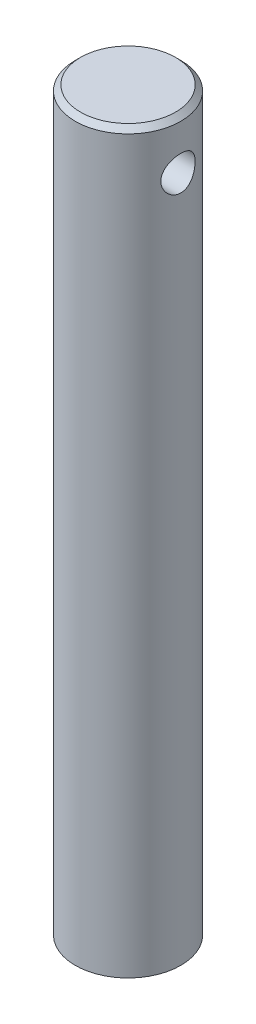
ISO-10303-21;
HEADER;
FILE_DESCRIPTION(('STEP AP214'),'2;1');
FILE_NAME('part.step','',(''),(''),'','','');
FILE_SCHEMA(('AUTOMOTIVE_DESIGN { 1 0 10303 214 1 1 1 1 }'));
ENDSEC;
DATA;
#1=APPLICATION_CONTEXT('core data for automotive mechanical design processes');
#2=APPLICATION_PROTOCOL_DEFINITION('international standard','automotive_design',2000,#1);
#3=PRODUCT_CONTEXT('',#1,'mechanical');
#4=PRODUCT('Part','Part','',(#3));
#5=PRODUCT_RELATED_PRODUCT_CATEGORY('part','',(#4));
#6=PRODUCT_DEFINITION_FORMATION('','',#4);
#7=PRODUCT_DEFINITION_CONTEXT('part definition',#1,'design');
#8=PRODUCT_DEFINITION('design','',#6,#7);
#9=PRODUCT_DEFINITION_SHAPE('','',#8);
#10=(LENGTH_UNIT() NAMED_UNIT(*) SI_UNIT(.MILLI.,.METRE.));
#11=(NAMED_UNIT(*) PLANE_ANGLE_UNIT() SI_UNIT($,.RADIAN.));
#12=(NAMED_UNIT(*) SI_UNIT($,.STERADIAN.) SOLID_ANGLE_UNIT());
#13=UNCERTAINTY_MEASURE_WITH_UNIT(LENGTH_MEASURE(1.E-05),#10,'distance_accuracy_value','');
#14=(GEOMETRIC_REPRESENTATION_CONTEXT(3) GLOBAL_UNCERTAINTY_ASSIGNED_CONTEXT((#13)) GLOBAL_UNIT_ASSIGNED_CONTEXT((#10,
#11,#12)) REPRESENTATION_CONTEXT('',''));
#15=CARTESIAN_POINT('',(0.,0.,0.));
#16=DIRECTION('',(0.,0.,1.));
#17=DIRECTION('',(1.,0.,0.));
#18=AXIS2_PLACEMENT_3D('',#15,#16,#17);
#19=CARTESIAN_POINT('',(0.,9.5,0.));
#20=DIRECTION('',(0.,-1.,0.));
#21=DIRECTION('',(1.,0.,0.));
#22=AXIS2_PLACEMENT_3D('',#19,#20,#21);
#23=CYLINDRICAL_SURFACE('',#22,10.);
#24=CARTESIAN_POINT('',(0.,8.50000000000004,0.));
#25=DIRECTION('',(0.,1.,0.));
#26=DIRECTION('',(-1.,0.,0.));
#27=AXIS2_PLACEMENT_3D('',#24,#25,#26);
#28=CIRCLE('',#27,10.);
#29=CARTESIAN_POINT('',(-10.,8.50000000000004,0.));
#30=VERTEX_POINT('',#29);
#31=EDGE_CURVE('E43',#30,#30,#28,.F.);
#32=ORIENTED_EDGE('',*,*,#31,.T.);
#33=EDGE_LOOP('',(#32));
#34=FACE_BOUND('',#33,.T.);
#35=CARTESIAN_POINT('',(10.,3.24999999999999,0.));
#36=CARTESIAN_POINT('',(9.99999989374565,3.24999997889345,0.177579382949033));
#37=CARTESIAN_POINT('',(9.99522579386108,3.23539803652838,0.355160799428107));
#38=CARTESIAN_POINT('',(9.97665017824228,3.17754433327152,0.705108112257457));
#39=CARTESIAN_POINT('',(9.96284727999529,3.13428818476131,0.877473205641292));
#40=CARTESIAN_POINT('',(9.92771716006863,3.02075477282472,1.21189182680223));
#41=CARTESIAN_POINT('',(9.90640214525769,2.95052132980789,1.37396158278685));
#42=CARTESIAN_POINT('',(9.85843361438871,2.78522034821618,1.684022624021));
#43=CARTESIAN_POINT('',(9.83177912896556,2.69014829931106,1.83201134569423));
#44=CARTESIAN_POINT('',(9.77495932247797,2.47455893870756,2.11461081148197));
#45=CARTESIAN_POINT('',(9.74471295358529,2.3533668062036,2.24869037174635));
#46=CARTESIAN_POINT('',(9.68457368482561,2.09041303391271,2.49502344091045));
#47=CARTESIAN_POINT('',(9.65468085893924,1.9486471685403,2.60727245498119));
#48=CARTESIAN_POINT('',(9.59775056049016,1.64386297324906,2.80972801137822));
#49=CARTESIAN_POINT('',(9.57081237727236,1.48037295020163,2.89925504445895));
#50=CARTESIAN_POINT('',(9.52406830823477,1.13964009979186,3.04931887139798));
#51=CARTESIAN_POINT('',(9.50426036852438,0.962401250734404,3.10986401524673));
#52=CARTESIAN_POINT('',(9.47487062348531,0.605224003478048,3.19827260971517));
#53=CARTESIAN_POINT('',(9.46497952226559,0.425557170356609,3.22712741042678));
#54=CARTESIAN_POINT('',(9.45562707493594,0.0636810429937451,3.25443459132066));
#55=CARTESIAN_POINT('',(9.45616269242515,-0.118527495623612,3.25289582251764));
#56=CARTESIAN_POINT('',(9.46733131423129,-0.471965078358155,3.22023155138035));
#57=CARTESIAN_POINT('',(9.47752750417875,-0.643328575736205,3.19038591816137));
#58=CARTESIAN_POINT('',(9.50615574812356,-0.978469733817753,3.10403782395805));
#59=CARTESIAN_POINT('',(9.52458874278655,-1.14224652574034,3.04753231830215));
#60=CARTESIAN_POINT('',(9.56793440052134,-1.46053027476877,2.90860404188738));
#61=CARTESIAN_POINT('',(9.5929431291382,-1.61485405825679,2.82579288678075));
#62=CARTESIAN_POINT('',(9.64658062480913,-1.90782592967286,2.63687365185909));
#63=CARTESIAN_POINT('',(9.67521039451251,-2.04646965564834,2.53075911343125));
#64=CARTESIAN_POINT('',(9.73459644737762,-2.31135580532947,2.29204406554377));
#65=CARTESIAN_POINT('',(9.76538786414675,-2.4366454392497,2.1583929888821));
#66=CARTESIAN_POINT('',(9.82438470108507,-2.66327506616693,1.87159594889805));
#67=CARTESIAN_POINT('',(9.85258989700937,-2.76461298356881,1.71844829781995));
#68=CARTESIAN_POINT('',(9.90357541398692,-2.94117958036254,1.39505996296229));
#69=CARTESIAN_POINT('',(9.92630448856869,-3.01616441859854,1.22467751353945));
#70=CARTESIAN_POINT('',(9.96340575158467,-3.13611754909862,0.872803501369045));
#71=CARTESIAN_POINT('',(9.97778069343972,-3.18109573191634,0.691315620659397));
#72=CARTESIAN_POINT('',(9.99610319938068,-3.2380973104139,0.330457295677702));
#73=CARTESIAN_POINT('',(10.0004581918424,-3.25140912385828,0.151310774152573));
#74=CARTESIAN_POINT('',(9.99946515119833,-3.2483550046277,-0.206684753642995));
#75=CARTESIAN_POINT('',(9.99411866512873,-3.23199380372956,-0.385533802797554));
#76=CARTESIAN_POINT('',(9.97459190888947,-3.17108387458638,-0.732777014929088));
#77=CARTESIAN_POINT('',(9.96065655544011,-3.12731612588182,-0.901323284372871));
#78=CARTESIAN_POINT('',(9.92560343144515,-3.01380236012891,-1.22862125569252));
#79=CARTESIAN_POINT('',(9.90448475494932,-2.94405306622037,-1.38737171915065));
#80=CARTESIAN_POINT('',(9.85654869030636,-2.77857272976549,-1.69509055480488));
#81=CARTESIAN_POINT('',(9.82959944293601,-2.68222317512508,-1.84370519348154));
#82=CARTESIAN_POINT('',(9.77306882676684,-2.46701009602674,-2.12308150730875));
#83=CARTESIAN_POINT('',(9.74348669127606,-2.34814000218299,-2.25383795390917));
#84=CARTESIAN_POINT('',(9.68341394517995,-2.08519902195576,-2.49964097258611));
#85=CARTESIAN_POINT('',(9.65293908057768,-1.94026325876254,-2.61376838975716));
#86=CARTESIAN_POINT('',(9.59584349220032,-1.63263899734481,-2.81618275812032));
#87=CARTESIAN_POINT('',(9.56922275883548,-1.46995054329393,-2.90446977360853));
#88=CARTESIAN_POINT('',(9.52312626728825,-1.1315474606046,-3.05222465357593));
#89=CARTESIAN_POINT('',(9.50363019104654,-0.955871619536967,-3.11177462835521));
#90=CARTESIAN_POINT('',(9.47422438151486,-0.59621221842745,-3.20020095668875));
#91=CARTESIAN_POINT('',(9.4643106083648,-0.412232193668311,-3.22909023717127));
#92=CARTESIAN_POINT('',(9.45563586870718,-0.0508598825570302,-3.2543985483994));
#93=CARTESIAN_POINT('',(9.45635339998917,0.126414793097428,-3.25233581624123));
#94=CARTESIAN_POINT('',(9.46758016662914,0.47795399616682,-3.21950614466644));
#95=CARTESIAN_POINT('',(9.47808887260454,0.652218685804804,-3.18874075712543));
#96=CARTESIAN_POINT('',(9.50733511912922,0.989832105728194,-3.10043070730133));
#97=CARTESIAN_POINT('',(9.52592844913926,1.15331678677853,-3.0433543427512));
#98=CARTESIAN_POINT('',(9.5692021691022,1.4685171754486,-2.90441722996808));
#99=CARTESIAN_POINT('',(9.59388386623479,1.62023034650381,-2.82255115849536));
#100=CARTESIAN_POINT('',(9.64784088636398,1.91445618346344,-2.63235879697991));
#101=CARTESIAN_POINT('',(9.67726517521805,2.05631852137468,-2.52306891129122));
#102=CARTESIAN_POINT('',(9.73674387050347,2.32018090698315,-2.28278717900074));
#103=CARTESIAN_POINT('',(9.76679844907542,2.44217544662851,-2.15178933442871));
#104=CARTESIAN_POINT('',(9.8254625209376,2.66729679821816,-1.86608754817447));
#105=CARTESIAN_POINT('',(9.85397977542082,2.76957658814279,-1.71069498742675));
#106=CARTESIAN_POINT('',(9.90514098282108,2.94644065367727,-1.38400159009725));
#107=CARTESIAN_POINT('',(9.92778677175249,3.0210335901562,-1.21270574929994));
#108=CARTESIAN_POINT('',(9.96349655119001,3.13633303599046,-0.869832380696061));
#109=CARTESIAN_POINT('',(9.97706030755102,3.17882738920053,-0.698908003473844));
#110=CARTESIAN_POINT('',(9.9953110007797,3.23565744357245,-0.351988917437685));
#111=CARTESIAN_POINT('',(10.0000001053066,3.25000002091827,-0.175995457426613));
#112=CARTESIAN_POINT('',(10.,3.24999999999999,0.));
#113=B_SPLINE_CURVE_WITH_KNOTS('',3,(#35,#36,#37,#38,#39,#40,#41,#42,#43,#44,#45,#46,#47,#48,
#49,#50,#51,#52,#53,#54,#55,#56,#57,#58,#59,#60,#61,#62,#63,#64,#65,#66,#67,#68,#69,#70,#71,#72,
#73,#74,#75,#76,#77,#78,#79,#80,#81,#82,#83,#84,#85,#86,#87,#88,#89,#90,#91,#92,#93,#94,#95,#96,
#97,#98,#99,#100,#101,#102,#103,#104,#105,#106,#107,#108,#109,#110,#111,#112),.UNSPECIFIED.,.T.,
.F.,(4,2,2,2,2,2,2,2,2,2,2,2,2,2,2,2,2,2,2,2,2,2,2,2,2,2,2,2,2,2,2,2,2,2,2,2,2,2,4),(0.,
0.532090801254675,1.06426309669591,1.59557459199054,2.1269826328768,2.67425296309552,
3.22163585524025,3.78384740278182,4.34589687356043,4.88981368187706,5.43357209666655,
5.95386117923409,6.47420969543024,7.00262882865677,7.53119460031025,8.0859084644215,
8.64067038102182,9.20043805582586,9.76002113320903,10.2964148728263,10.8327230844865,
11.3544036147969,11.8761499631048,12.4112318399366,12.9464700445871,13.5047604456697,
14.0630494576022,14.6197336846483,15.1761831133819,15.7054311330744,16.2346505394039,
16.7547941299286,17.2750494932519,17.8170673976498,18.3592353135955,18.9211107593864,
19.4828102935622,20.0102839458811,20.537628744608),.UNSPECIFIED.);
#114=CARTESIAN_POINT('',(10.,3.24999999999999,0.));
#115=VERTEX_POINT('',#114);
#116=EDGE_CURVE('E47',#115,#115,#113,.T.);
#117=ORIENTED_EDGE('',*,*,#116,.F.);
#118=EDGE_LOOP('',(#117));
#119=FACE_BOUND('',#118,.T.);
#120=CARTESIAN_POINT('',(-9.45714015968887,0.,3.24999999999999));
#121=CARTESIAN_POINT('',(-9.45714031975425,0.177299530983938,3.24999996594419));
#122=CARTESIAN_POINT('',(-9.46218061553846,0.354601079058454,3.23544233910945));
#123=CARTESIAN_POINT('',(-9.48169889974067,0.703969232437981,3.17778063387204));
#124=CARTESIAN_POINT('',(-9.49617883832328,0.87603474832516,3.13467065672282));
#125=CARTESIAN_POINT('',(-9.53276684736511,1.20981611796559,3.02156408763779));
#126=CARTESIAN_POINT('',(-9.55486055631606,1.37155078233966,2.95161808731895));
#127=CARTESIAN_POINT('',(-9.60416619680663,1.68103928814958,2.78699619388973));
#128=CARTESIAN_POINT('',(-9.63137916829215,1.82879027970761,2.6923152745147));
#129=CARTESIAN_POINT('',(-9.68899176574426,2.11161020214042,2.47714104411861));
#130=CARTESIAN_POINT('',(-9.7194679228496,2.2460831711087,2.35588471696471));
#131=CARTESIAN_POINT('',(-9.77952436884652,2.4931889671246,2.09263184494553));
#132=CARTESIAN_POINT('',(-9.8091045211573,2.60581847850233,1.95063215712303));
#133=CARTESIAN_POINT('',(-9.86491782280745,2.8087140059434,1.64559602796292));
#134=CARTESIAN_POINT('',(-9.89105042825693,2.89835993814045,1.48212711806989));
#135=CARTESIAN_POINT('',(-9.9361257418338,3.0486489618789,1.14143632793767));
#136=CARTESIAN_POINT('',(-9.95507028595169,3.10929946052839,0.96421797356028));
#137=CARTESIAN_POINT('',(-9.98309301263069,3.19786767905724,0.60730397546392));
#138=CARTESIAN_POINT('',(-9.99247790860662,3.22680538131057,0.427885967277268));
#139=CARTESIAN_POINT('',(-10.0014104232845,3.25436508562661,0.066512037622937));
#140=CARTESIAN_POINT('',(-10.0009604553388,3.2529945249563,-0.115443250276201));
#141=CARTESIAN_POINT('',(-9.99048411795756,3.22063335722291,-0.469523771450078));
#142=CARTESIAN_POINT('',(-9.98081565195022,3.19074972479527,-0.641762482940367));
#143=CARTESIAN_POINT('',(-9.95343429447757,3.1040354917331,-0.97863224640162));
#144=CARTESIAN_POINT('',(-9.93572086532967,3.04720308997488,-1.14326278907262));
#145=CARTESIAN_POINT('',(-9.89377411201859,2.90753211380048,-1.46271759756165));
#146=CARTESIAN_POINT('',(-9.869460261881,2.82437007909694,-1.61738943124247));
#147=CARTESIAN_POINT('',(-9.816856159246,2.6346641048776,-1.91091693128666));
#148=CARTESIAN_POINT('',(-9.78856484119447,2.52811389541833,-2.04976834129095));
#149=CARTESIAN_POINT('',(-9.72950106071726,2.28903467266802,-2.31430549384568));
#150=CARTESIAN_POINT('',(-9.69867422994172,2.15555416928405,-2.43912040936659));
#151=CARTESIAN_POINT('',(-9.63909486372544,1.86928290948064,-2.66486690355385));
#152=CARTESIAN_POINT('',(-9.61034261635581,1.7164894793945,-2.76579516980326));
#153=CARTESIAN_POINT('',(-9.55787955588514,1.39329252750949,-2.94202938013297));
#154=CARTESIAN_POINT('',(-9.53423890921103,1.22268644196096,-3.01698630603796));
#155=CARTESIAN_POINT('',(-9.49549194347806,0.870315322912828,-3.13682094119596));
#156=CARTESIAN_POINT('',(-9.48038225830743,0.68855472214663,-3.18171051560574));
#157=CARTESIAN_POINT('',(-9.46116378995737,0.327432460521432,-3.23840120551585));
#158=CARTESIAN_POINT('',(-9.45660869381159,0.148305376867856,-3.25154577533659));
#159=CARTESIAN_POINT('',(-9.45777099529463,-0.209616301729801,-3.24816506242595));
#160=CARTESIAN_POINT('',(-9.46348664335148,-0.388410948109536,-3.2316448329511));
#161=CARTESIAN_POINT('',(-9.48410320755962,-0.734615900338193,-3.17060807190335));
#162=CARTESIAN_POINT('',(-9.49870345169874,-0.902207412355537,-3.1270070478687));
#163=CARTESIAN_POINT('',(-9.53511831835135,-1.22766844067835,-3.0141352607906));
#164=CARTESIAN_POINT('',(-9.55693417915462,-1.38553628276091,-2.94486009149767));
#165=CARTESIAN_POINT('',(-9.60614721606396,-1.6924031656331,-2.78020029035673));
#166=CARTESIAN_POINT('',(-9.63369436385389,-1.84098469572416,-2.68408357895598));
#167=CARTESIAN_POINT('',(-9.69096725740347,-2.12039723434003,-2.46930881957964));
#168=CARTESIAN_POINT('',(-9.7206936131738,-2.25122324323777,-2.35064444508002));
#169=CARTESIAN_POINT('',(-9.780607139663,-2.4975409341215,-2.087745080266));
#170=CARTESIAN_POINT('',(-9.81075403007331,-2.61206762913436,-1.94259422975941));
#171=CARTESIAN_POINT('',(-9.86677456184763,-2.81519056272343,-1.63439731618794));
#172=CARTESIAN_POINT('',(-9.89264837523296,-2.90378784525126,-1.47135197394191));
#173=CARTESIAN_POINT('',(-9.93707445650379,-3.05170605154728,-1.13289346303608));
#174=CARTESIAN_POINT('',(-9.95567674524018,-3.11122772103829,-0.957574938068058));
#175=CARTESIAN_POINT('',(-9.98368172068449,-3.1997164245844,-0.598697534609189));
#176=CARTESIAN_POINT('',(-9.99308754661658,-3.22869388520756,-0.415141490398971));
#177=CARTESIAN_POINT('',(-10.0014145744501,-3.25436992604748,-0.0538483383324489));
#178=CARTESIAN_POINT('',(-10.0007868427667,-3.25245715886776,0.123780796472686));
#179=CARTESIAN_POINT('',(-9.99021560869602,-3.21980512056529,0.476070007471434));
#180=CARTESIAN_POINT('',(-9.98027280013974,-3.1890679964171,0.6507303038117));
#181=CARTESIAN_POINT('',(-9.95234501872029,-3.10054678173843,0.989620887576075));
#182=CARTESIAN_POINT('',(-9.93447846708206,-3.043160393528,1.15396550686852));
#183=CARTESIAN_POINT('',(-9.8925433503312,-2.90333387949336,1.47076416800392));
#184=CARTESIAN_POINT('',(-9.86847368418031,-2.82088930543359,1.62321609265707));
#185=CARTESIAN_POINT('',(-9.81555378161621,-2.629885547409,1.91784189154063));
#186=CARTESIAN_POINT('',(-9.78656335044512,-2.52049779238891,2.05945312297856));
#187=CARTESIAN_POINT('',(-9.72743554627142,-2.28014309487174,2.32276630111764));
#188=CARTESIAN_POINT('',(-9.69729781882272,-2.14916944132468,2.44446203257073));
#189=CARTESIAN_POINT('',(-9.63796513947999,-1.86361218902463,2.66901287727711));
#190=CARTESIAN_POINT('',(-9.60884528614325,-1.70833892746852,2.77101345238614));
#191=CARTESIAN_POINT('',(-9.5562255883988,-1.38195905685891,2.94738303474978));
#192=CARTESIAN_POINT('',(-9.53272393962415,-1.21085755582334,3.02176091768744));
#193=CARTESIAN_POINT('',(-9.49550334814009,-0.8684579158953,3.13669494452504));
#194=CARTESIAN_POINT('',(-9.48127131053796,-0.697820090795792,3.17905105398646));
#195=CARTESIAN_POINT('',(-9.46209103822374,-0.351454469118071,3.23569936279264));
#196=CARTESIAN_POINT('',(-9.45714000104206,-0.175728225307203,3.25000003375396));
#197=CARTESIAN_POINT('',(-9.45714015968887,0.,3.24999999999999));
#198=B_SPLINE_CURVE_WITH_KNOTS('',3,(#120,#121,#122,#123,#124,#125,#126,#127,#128,#129,#130,
#131,#132,#133,#134,#135,#136,#137,#138,#139,#140,#141,#142,#143,#144,#145,#146,#147,#148,#149,
#150,#151,#152,#153,#154,#155,#156,#157,#158,#159,#160,#161,#162,#163,#164,#165,#166,#167,#168,
#169,#170,#171,#172,#173,#174,#175,#176,#177,#178,#179,#180,#181,#182,#183,#184,#185,#186,#187,
#188,#189,#190,#191,#192,#193,#194,#195,#196,#197),.UNSPECIFIED.,.T.,.F.,(4,2,2,2,2,2,2,2,2,2,2,
2,2,2,2,2,2,2,2,2,2,2,2,2,2,2,2,2,2,2,2,2,2,2,2,2,2,2,4),(0.,0.53124850503718,1.06260679711987,
1.5929682491144,2.12343755726666,2.67180188546717,3.22024938614484,3.78222372984978,
4.34405443604297,4.88723029743205,5.43027287176743,5.95305557209679,6.4758732175863,
7.00538064397244,7.53503019539509,8.08845610905497,8.64195872265871,9.20263474595125,
9.76308938511444,10.2993744444866,10.8355681589328,11.3545536787972,11.8736283092984,
12.4085390846315,12.9436001698432,13.5029364155138,14.0622501384862,14.6176456234263,
15.1728514571604,15.7031706450782,16.2334503354495,16.7560588347682,17.2787601598329,
17.8201569265526,18.3617223320028,18.9231471315413,19.4843913784855,20.0110907944362,
20.5376311438055),.UNSPECIFIED.);
#199=CARTESIAN_POINT('',(-9.45714015968887,0.,3.24999999999999));
#200=VERTEX_POINT('',#199);
#201=EDGE_CURVE('E51',#200,#200,#198,.T.);
#202=ORIENTED_EDGE('',*,*,#201,.F.);
#203=EDGE_LOOP('',(#202));
#204=FACE_BOUND('',#203,.T.);
#205=CARTESIAN_POINT('',(0.,-130.,0.));
#206=DIRECTION('',(0.,-1.,0.));
#207=DIRECTION('',(1.,0.,0.));
#208=AXIS2_PLACEMENT_3D('',#205,#206,#207);
#209=CIRCLE('',#208,9.99999999999999);
#210=CARTESIAN_POINT('',(9.99999999999999,-130.,0.));
#211=VERTEX_POINT('',#210);
#212=EDGE_CURVE('E88',#211,#211,#209,.T.);
#213=ORIENTED_EDGE('',*,*,#212,.F.);
#214=EDGE_LOOP('',(#213));
#215=FACE_BOUND('',#214,.T.);
#216=ADVANCED_FACE('F35',(#34,#119,#204,#215),#23,.T.);
#217=CARTESIAN_POINT('',(10.,9.50000000000001,0.));
#218=DIRECTION('',(0.,1.,0.));
#219=DIRECTION('',(-1.,0.,0.));
#220=AXIS2_PLACEMENT_3D('',#217,#218,#219);
#221=PLANE('',#220);
#222=CARTESIAN_POINT('',(0.,9.50000000000001,0.));
#223=DIRECTION('',(0.,1.,0.));
#224=DIRECTION('',(-1.,0.,0.));
#225=AXIS2_PLACEMENT_3D('',#222,#223,#224);
#226=CIRCLE('',#225,9.00000000000002);
#227=CARTESIAN_POINT('',(-9.00000000000002,9.50000000000001,0.));
#228=VERTEX_POINT('',#227);
#229=EDGE_CURVE('E10',#228,#228,#226,.T.);
#230=ORIENTED_EDGE('',*,*,#229,.T.);
#231=EDGE_LOOP('',(#230));
#232=FACE_BOUND('',#231,.T.);
#233=ADVANCED_FACE('F72',(#232),#221,.T.);
#234=CARTESIAN_POINT('',(0.,-130.,0.));
#235=DIRECTION('',(0.,-1.,0.));
#236=DIRECTION('',(1.,0.,0.));
#237=AXIS2_PLACEMENT_3D('',#234,#235,#236);
#238=PLANE('',#237);
#239=ORIENTED_EDGE('',*,*,#212,.T.);
#240=EDGE_LOOP('',(#239));
#241=FACE_BOUND('',#240,.T.);
#242=ADVANCED_FACE('F68',(#241),#238,.T.);
#243=CARTESIAN_POINT('',(-10.,0.,0.));
#244=DIRECTION('',(-1.,0.,0.));
#245=DIRECTION('',(0.,0.,1.));
#246=AXIS2_PLACEMENT_3D('',#243,#244,#245);
#247=CYLINDRICAL_SURFACE('',#246,3.24999999999999);
#248=ORIENTED_EDGE('',*,*,#116,.T.);
#249=EDGE_LOOP('',(#248));
#250=FACE_BOUND('',#249,.T.);
#251=ORIENTED_EDGE('',*,*,#201,.T.);
#252=EDGE_LOOP('',(#251));
#253=FACE_BOUND('',#252,.T.);
#254=ADVANCED_FACE('F64',(#250,#253),#247,.F.);
#255=CARTESIAN_POINT('',(0.,8.50000000000004,0.));
#256=DIRECTION('',(0.,-1.,0.));
#257=DIRECTION('',(1.,0.,0.));
#258=AXIS2_PLACEMENT_3D('',#255,#256,#257);
#259=CONICAL_SURFACE('',#258,10.,0.785398163397455);
#260=ORIENTED_EDGE('',*,*,#229,.F.);
#261=EDGE_LOOP('',(#260));
#262=FACE_BOUND('',#261,.T.);
#263=ORIENTED_EDGE('',*,*,#31,.F.);
#264=EDGE_LOOP('',(#263));
#265=FACE_BOUND('',#264,.T.);
#266=ADVANCED_FACE('F38',(#262,#265),#259,.T.);
#267=CLOSED_SHELL('',(#216,#233,#242,#254,#266));
#268=MANIFOLD_SOLID_BREP('B2',#267);
#269=ADVANCED_BREP_SHAPE_REPRESENTATION('',(#18,#268),#14);
#270=SHAPE_DEFINITION_REPRESENTATION(#9,#269);
ENDSEC;
END-ISO-10303-21;
